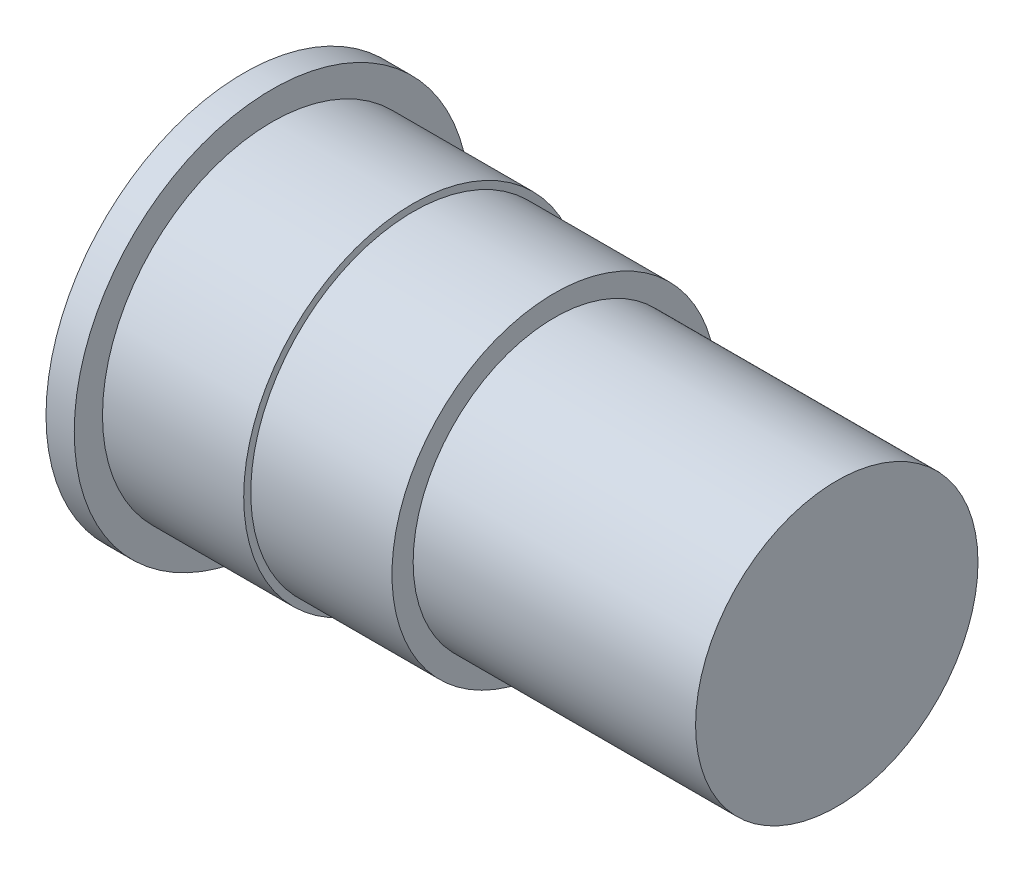
ISO-10303-21;
HEADER;
FILE_DESCRIPTION(('STEP AP214'),'2;1');
FILE_NAME('part.step','',(''),(''),'','','');
FILE_SCHEMA(('AUTOMOTIVE_DESIGN { 1 0 10303 214 1 1 1 1 }'));
ENDSEC;
DATA;
#1=APPLICATION_CONTEXT('core data for automotive mechanical design processes');
#2=APPLICATION_PROTOCOL_DEFINITION('international standard','automotive_design',2000,#1);
#3=PRODUCT_CONTEXT('',#1,'mechanical');
#4=PRODUCT('Part','Part','',(#3));
#5=PRODUCT_RELATED_PRODUCT_CATEGORY('part','',(#4));
#6=PRODUCT_DEFINITION_FORMATION('','',#4);
#7=PRODUCT_DEFINITION_CONTEXT('part definition',#1,'design');
#8=PRODUCT_DEFINITION('design','',#6,#7);
#9=PRODUCT_DEFINITION_SHAPE('','',#8);
#10=(LENGTH_UNIT() NAMED_UNIT(*) SI_UNIT(.MILLI.,.METRE.));
#11=(NAMED_UNIT(*) PLANE_ANGLE_UNIT() SI_UNIT($,.RADIAN.));
#12=(NAMED_UNIT(*) SI_UNIT($,.STERADIAN.) SOLID_ANGLE_UNIT());
#13=UNCERTAINTY_MEASURE_WITH_UNIT(LENGTH_MEASURE(1.E-05),#10,'distance_accuracy_value','');
#14=(GEOMETRIC_REPRESENTATION_CONTEXT(3) GLOBAL_UNCERTAINTY_ASSIGNED_CONTEXT((#13)) GLOBAL_UNIT_ASSIGNED_CONTEXT((#10,
#11,#12)) REPRESENTATION_CONTEXT('',''));
#15=CARTESIAN_POINT('',(0.,0.,0.));
#16=DIRECTION('',(0.,0.,1.));
#17=DIRECTION('',(1.,0.,0.));
#18=AXIS2_PLACEMENT_3D('',#15,#16,#17);
#19=CARTESIAN_POINT('',(11.,0.,0.));
#20=DIRECTION('',(1.,0.,0.));
#21=DIRECTION('',(0.,0.,-1.));
#22=AXIS2_PLACEMENT_3D('',#19,#20,#21);
#23=PLANE('',#22);
#24=CARTESIAN_POINT('',(11.,0.,0.));
#25=DIRECTION('',(1.,0.,0.));
#26=DIRECTION('',(0.,0.,-1.));
#27=AXIS2_PLACEMENT_3D('',#24,#25,#26);
#28=CIRCLE('',#27,5.75);
#29=CARTESIAN_POINT('',(11.,0.,-5.75));
#30=VERTEX_POINT('',#29);
#31=EDGE_CURVE('E48',#30,#30,#28,.T.);
#32=ORIENTED_EDGE('',*,*,#31,.T.);
#33=EDGE_LOOP('',(#32));
#34=FACE_BOUND('',#33,.T.);
#35=CARTESIAN_POINT('',(11.,0.,0.));
#36=DIRECTION('',(1.,0.,0.));
#37=DIRECTION('',(0.,0.,-1.));
#38=AXIS2_PLACEMENT_3D('',#35,#36,#37);
#39=CIRCLE('',#38,5.);
#40=CARTESIAN_POINT('',(11.,0.,-5.));
#41=VERTEX_POINT('',#40);
#42=EDGE_CURVE('E57',#41,#41,#39,.T.);
#43=ORIENTED_EDGE('',*,*,#42,.F.);
#44=EDGE_LOOP('',(#43));
#45=FACE_BOUND('',#44,.T.);
#46=ADVANCED_FACE('F32',(#34,#45),#23,.T.);
#47=CARTESIAN_POINT('',(6.,0.,0.));
#48=DIRECTION('',(1.,0.,0.));
#49=DIRECTION('',(0.,0.,-1.));
#50=AXIS2_PLACEMENT_3D('',#47,#48,#49);
#51=PLANE('',#50);
#52=CARTESIAN_POINT('',(6.,0.,0.));
#53=DIRECTION('',(1.,0.,0.));
#54=DIRECTION('',(0.,0.,-1.));
#55=AXIS2_PLACEMENT_3D('',#52,#53,#54);
#56=CIRCLE('',#55,6.);
#57=CARTESIAN_POINT('',(6.,0.,-6.));
#58=VERTEX_POINT('',#57);
#59=EDGE_CURVE('E43',#58,#58,#56,.T.);
#60=ORIENTED_EDGE('',*,*,#59,.T.);
#61=EDGE_LOOP('',(#60));
#62=FACE_BOUND('',#61,.T.);
#63=CARTESIAN_POINT('',(6.,0.,0.));
#64=DIRECTION('',(1.,0.,0.));
#65=DIRECTION('',(0.,0.,-1.));
#66=AXIS2_PLACEMENT_3D('',#63,#64,#65);
#67=CIRCLE('',#66,5.75);
#68=CARTESIAN_POINT('',(6.,0.,-5.75));
#69=VERTEX_POINT('',#68);
#70=EDGE_CURVE('E51',#69,#69,#67,.T.);
#71=ORIENTED_EDGE('',*,*,#70,.F.);
#72=EDGE_LOOP('',(#71));
#73=FACE_BOUND('',#72,.T.);
#74=ADVANCED_FACE('F73',(#62,#73),#51,.T.);
#75=CARTESIAN_POINT('',(1.,0.,0.));
#76=DIRECTION('',(1.,0.,0.));
#77=DIRECTION('',(0.,0.,-1.));
#78=AXIS2_PLACEMENT_3D('',#75,#76,#77);
#79=PLANE('',#78);
#80=CARTESIAN_POINT('',(1.,0.,0.));
#81=DIRECTION('',(1.,0.,0.));
#82=DIRECTION('',(0.,0.,-1.));
#83=AXIS2_PLACEMENT_3D('',#80,#81,#82);
#84=CIRCLE('',#83,7.);
#85=CARTESIAN_POINT('',(1.,0.,-7.));
#86=VERTEX_POINT('',#85);
#87=EDGE_CURVE('E10',#86,#86,#84,.T.);
#88=ORIENTED_EDGE('',*,*,#87,.T.);
#89=EDGE_LOOP('',(#88));
#90=FACE_BOUND('',#89,.T.);
#91=CARTESIAN_POINT('',(1.,0.,0.));
#92=DIRECTION('',(1.,0.,0.));
#93=DIRECTION('',(0.,0.,-1.));
#94=AXIS2_PLACEMENT_3D('',#91,#92,#93);
#95=CIRCLE('',#94,6.);
#96=CARTESIAN_POINT('',(1.,0.,-6.));
#97=VERTEX_POINT('',#96);
#98=EDGE_CURVE('E45',#97,#97,#95,.T.);
#99=ORIENTED_EDGE('',*,*,#98,.F.);
#100=EDGE_LOOP('',(#99));
#101=FACE_BOUND('',#100,.T.);
#102=ADVANCED_FACE('F79',(#90,#101),#79,.T.);
#103=CARTESIAN_POINT('',(1.,0.,0.));
#104=DIRECTION('',(-1.,0.,0.));
#105=DIRECTION('',(0.,0.,1.));
#106=AXIS2_PLACEMENT_3D('',#103,#104,#105);
#107=CYLINDRICAL_SURFACE('',#106,7.);
#108=ORIENTED_EDGE('',*,*,#87,.F.);
#109=EDGE_LOOP('',(#108));
#110=FACE_BOUND('',#109,.T.);
#111=CARTESIAN_POINT('',(0.,0.,0.));
#112=DIRECTION('',(1.,0.,0.));
#113=DIRECTION('',(0.,0.,-1.));
#114=AXIS2_PLACEMENT_3D('',#111,#112,#113);
#115=CIRCLE('',#114,7.);
#116=CARTESIAN_POINT('',(0.,0.,-7.));
#117=VERTEX_POINT('',#116);
#118=EDGE_CURVE('E36',#117,#117,#115,.T.);
#119=ORIENTED_EDGE('',*,*,#118,.T.);
#120=EDGE_LOOP('',(#119));
#121=FACE_BOUND('',#120,.T.);
#122=ADVANCED_FACE('F34',(#110,#121),#107,.T.);
#123=CARTESIAN_POINT('',(0.,0.,0.));
#124=DIRECTION('',(1.,0.,0.));
#125=DIRECTION('',(0.,0.,-1.));
#126=AXIS2_PLACEMENT_3D('',#123,#124,#125);
#127=PLANE('',#126);
#128=ORIENTED_EDGE('',*,*,#118,.F.);
#129=EDGE_LOOP('',(#128));
#130=FACE_BOUND('',#129,.T.);
#131=ADVANCED_FACE('F90',(#130),#127,.F.);
#132=CARTESIAN_POINT('',(6.,0.,0.));
#133=DIRECTION('',(-1.,0.,0.));
#134=DIRECTION('',(0.,0.,1.));
#135=AXIS2_PLACEMENT_3D('',#132,#133,#134);
#136=CYLINDRICAL_SURFACE('',#135,6.);
#137=ORIENTED_EDGE('',*,*,#59,.F.);
#138=EDGE_LOOP('',(#137));
#139=FACE_BOUND('',#138,.T.);
#140=ORIENTED_EDGE('',*,*,#98,.T.);
#141=EDGE_LOOP('',(#140));
#142=FACE_BOUND('',#141,.T.);
#143=ADVANCED_FACE('F85',(#139,#142),#136,.T.);
#144=CARTESIAN_POINT('',(11.,0.,0.));
#145=DIRECTION('',(-1.,0.,0.));
#146=DIRECTION('',(0.,0.,1.));
#147=AXIS2_PLACEMENT_3D('',#144,#145,#146);
#148=CYLINDRICAL_SURFACE('',#147,5.75);
#149=ORIENTED_EDGE('',*,*,#31,.F.);
#150=EDGE_LOOP('',(#149));
#151=FACE_BOUND('',#150,.T.);
#152=ORIENTED_EDGE('',*,*,#70,.T.);
#153=EDGE_LOOP('',(#152));
#154=FACE_BOUND('',#153,.T.);
#155=ADVANCED_FACE('F68',(#151,#154),#148,.T.);
#156=CARTESIAN_POINT('',(21.,0.,0.));
#157=DIRECTION('',(-1.,0.,0.));
#158=DIRECTION('',(0.,0.,1.));
#159=AXIS2_PLACEMENT_3D('',#156,#157,#158);
#160=CYLINDRICAL_SURFACE('',#159,5.);
#161=CARTESIAN_POINT('',(21.,0.,0.));
#162=DIRECTION('',(1.,0.,0.));
#163=DIRECTION('',(0.,0.,-1.));
#164=AXIS2_PLACEMENT_3D('',#161,#162,#163);
#165=CIRCLE('',#164,5.);
#166=CARTESIAN_POINT('',(21.,0.,-5.));
#167=VERTEX_POINT('',#166);
#168=EDGE_CURVE('E54',#167,#167,#165,.T.);
#169=ORIENTED_EDGE('',*,*,#168,.F.);
#170=EDGE_LOOP('',(#169));
#171=FACE_BOUND('',#170,.T.);
#172=ORIENTED_EDGE('',*,*,#42,.T.);
#173=EDGE_LOOP('',(#172));
#174=FACE_BOUND('',#173,.T.);
#175=ADVANCED_FACE('F65',(#171,#174),#160,.T.);
#176=CARTESIAN_POINT('',(21.,0.,0.));
#177=DIRECTION('',(1.,0.,0.));
#178=DIRECTION('',(0.,0.,-1.));
#179=AXIS2_PLACEMENT_3D('',#176,#177,#178);
#180=PLANE('',#179);
#181=ORIENTED_EDGE('',*,*,#168,.T.);
#182=EDGE_LOOP('',(#181));
#183=FACE_BOUND('',#182,.T.);
#184=ADVANCED_FACE('F63',(#183),#180,.T.);
#185=CLOSED_SHELL('',(#46,#74,#102,#122,#131,#143,#155,#175,#184));
#186=MANIFOLD_SOLID_BREP('B2',#185);
#187=ADVANCED_BREP_SHAPE_REPRESENTATION('',(#18,#186),#14);
#188=SHAPE_DEFINITION_REPRESENTATION(#9,#187);
ENDSEC;
END-ISO-10303-21;
